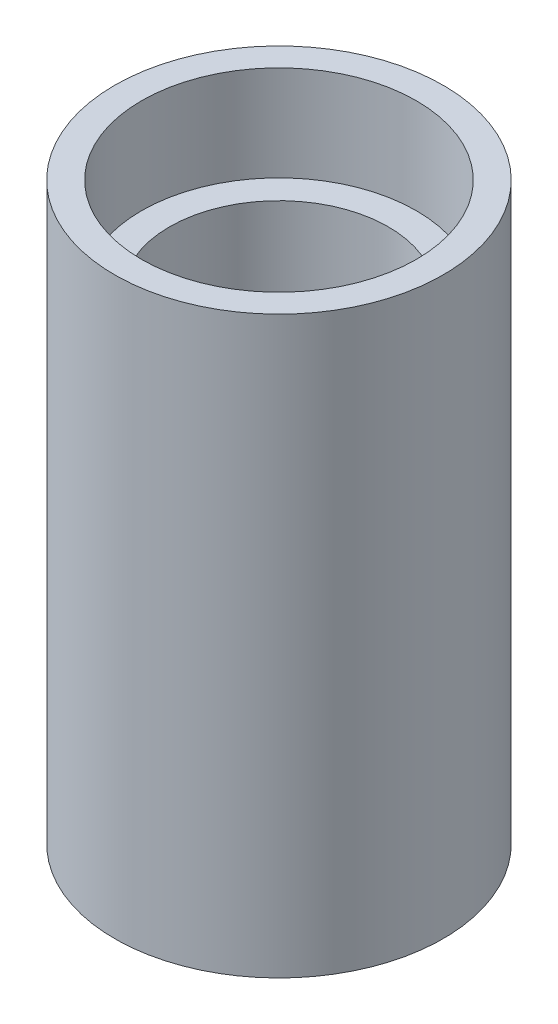
ISO-10303-21;
HEADER;
FILE_DESCRIPTION(('STEP AP214'),'2;1');
FILE_NAME('part.step','',(''),(''),'','','');
FILE_SCHEMA(('AUTOMOTIVE_DESIGN { 1 0 10303 214 1 1 1 1 }'));
ENDSEC;
DATA;
#1=APPLICATION_CONTEXT('core data for automotive mechanical design processes');
#2=APPLICATION_PROTOCOL_DEFINITION('international standard','automotive_design',2000,#1);
#3=PRODUCT_CONTEXT('',#1,'mechanical');
#4=PRODUCT('Part','Part','',(#3));
#5=PRODUCT_RELATED_PRODUCT_CATEGORY('part','',(#4));
#6=PRODUCT_DEFINITION_FORMATION('','',#4);
#7=PRODUCT_DEFINITION_CONTEXT('part definition',#1,'design');
#8=PRODUCT_DEFINITION('design','',#6,#7);
#9=PRODUCT_DEFINITION_SHAPE('','',#8);
#10=(LENGTH_UNIT() NAMED_UNIT(*) SI_UNIT(.MILLI.,.METRE.));
#11=(NAMED_UNIT(*) PLANE_ANGLE_UNIT() SI_UNIT($,.RADIAN.));
#12=(NAMED_UNIT(*) SI_UNIT($,.STERADIAN.) SOLID_ANGLE_UNIT());
#13=UNCERTAINTY_MEASURE_WITH_UNIT(LENGTH_MEASURE(1.E-05),#10,'distance_accuracy_value','');
#14=(GEOMETRIC_REPRESENTATION_CONTEXT(3) GLOBAL_UNCERTAINTY_ASSIGNED_CONTEXT((#13)) GLOBAL_UNIT_ASSIGNED_CONTEXT((#10,
#11,#12)) REPRESENTATION_CONTEXT('',''));
#15=CARTESIAN_POINT('',(0.,0.,0.));
#16=DIRECTION('',(0.,0.,1.));
#17=DIRECTION('',(1.,0.,0.));
#18=AXIS2_PLACEMENT_3D('',#15,#16,#17);
#19=CARTESIAN_POINT('',(0.,55.7467725164634,0.));
#20=DIRECTION('',(0.,1.,0.));
#21=DIRECTION('',(-1.,0.,0.));
#22=AXIS2_PLACEMENT_3D('',#19,#20,#21);
#23=CYLINDRICAL_SURFACE('',#22,25.4);
#24=CARTESIAN_POINT('',(0.,0.,0.));
#25=DIRECTION('',(0.,1.,0.));
#26=DIRECTION('',(-1.,0.,0.));
#27=AXIS2_PLACEMENT_3D('',#24,#25,#26);
#28=CIRCLE('',#27,25.4);
#29=CARTESIAN_POINT('',(-25.4,0.,0.));
#30=VERTEX_POINT('',#29);
#31=EDGE_CURVE('E57',#30,#30,#28,.T.);
#32=ORIENTED_EDGE('',*,*,#31,.F.);
#33=EDGE_LOOP('',(#32));
#34=FACE_BOUND('',#33,.T.);
#35=CARTESIAN_POINT('',(0.,111.252,0.));
#36=DIRECTION('',(0.,1.,0.));
#37=DIRECTION('',(-1.,0.,0.));
#38=AXIS2_PLACEMENT_3D('',#35,#36,#37);
#39=CIRCLE('',#38,25.4);
#40=CARTESIAN_POINT('',(-25.4,111.252,0.));
#41=VERTEX_POINT('',#40);
#42=EDGE_CURVE('E10',#41,#41,#39,.T.);
#43=ORIENTED_EDGE('',*,*,#42,.T.);
#44=EDGE_LOOP('',(#43));
#45=FACE_BOUND('',#44,.T.);
#46=ADVANCED_FACE('F35',(#34,#45),#23,.F.);
#47=CARTESIAN_POINT('',(25.4,111.252,0.));
#48=DIRECTION('',(0.,-1.,0.));
#49=DIRECTION('',(1.,0.,0.));
#50=AXIS2_PLACEMENT_3D('',#47,#48,#49);
#51=PLANE('',#50);
#52=ORIENTED_EDGE('',*,*,#42,.F.);
#53=EDGE_LOOP('',(#52));
#54=FACE_BOUND('',#53,.T.);
#55=CARTESIAN_POINT('',(0.,111.252,0.));
#56=DIRECTION('',(0.,1.,0.));
#57=DIRECTION('',(-1.,0.,0.));
#58=AXIS2_PLACEMENT_3D('',#55,#56,#57);
#59=CIRCLE('',#58,31.877);
#60=CARTESIAN_POINT('',(-31.877,111.252,0.));
#61=VERTEX_POINT('',#60);
#62=EDGE_CURVE('E41',#61,#61,#59,.T.);
#63=ORIENTED_EDGE('',*,*,#62,.T.);
#64=EDGE_LOOP('',(#63));
#65=FACE_BOUND('',#64,.T.);
#66=ADVANCED_FACE('F64',(#54,#65),#51,.F.);
#67=CARTESIAN_POINT('',(0.,55.7467725164634,0.));
#68=DIRECTION('',(0.,1.,0.));
#69=DIRECTION('',(-1.,0.,0.));
#70=AXIS2_PLACEMENT_3D('',#67,#68,#69);
#71=CYLINDRICAL_SURFACE('',#70,31.877);
#72=ORIENTED_EDGE('',*,*,#62,.F.);
#73=EDGE_LOOP('',(#72));
#74=FACE_BOUND('',#73,.T.);
#75=CARTESIAN_POINT('',(0.,133.35,0.));
#76=DIRECTION('',(0.,1.,0.));
#77=DIRECTION('',(-1.,0.,0.));
#78=AXIS2_PLACEMENT_3D('',#75,#76,#77);
#79=CIRCLE('',#78,31.877);
#80=CARTESIAN_POINT('',(-31.877,133.35,0.));
#81=VERTEX_POINT('',#80);
#82=EDGE_CURVE('E45',#81,#81,#79,.T.);
#83=ORIENTED_EDGE('',*,*,#82,.T.);
#84=EDGE_LOOP('',(#83));
#85=FACE_BOUND('',#84,.T.);
#86=ADVANCED_FACE('F68',(#74,#85),#71,.F.);
#87=CARTESIAN_POINT('',(31.877,133.35,0.));
#88=DIRECTION('',(0.,-1.,0.));
#89=DIRECTION('',(1.,0.,0.));
#90=AXIS2_PLACEMENT_3D('',#87,#88,#89);
#91=PLANE('',#90);
#92=ORIENTED_EDGE('',*,*,#82,.F.);
#93=EDGE_LOOP('',(#92));
#94=FACE_BOUND('',#93,.T.);
#95=CARTESIAN_POINT('',(0.,133.35,0.));
#96=DIRECTION('',(0.,1.,0.));
#97=DIRECTION('',(-1.,0.,0.));
#98=AXIS2_PLACEMENT_3D('',#95,#96,#97);
#99=CIRCLE('',#98,38.1);
#100=CARTESIAN_POINT('',(-38.1,133.35,0.));
#101=VERTEX_POINT('',#100);
#102=EDGE_CURVE('E49',#101,#101,#99,.T.);
#103=ORIENTED_EDGE('',*,*,#102,.T.);
#104=EDGE_LOOP('',(#103));
#105=FACE_BOUND('',#104,.T.);
#106=ADVANCED_FACE('F73',(#94,#105),#91,.F.);
#107=CARTESIAN_POINT('',(0.,55.7467725164634,0.));
#108=DIRECTION('',(0.,1.,0.));
#109=DIRECTION('',(-1.,0.,0.));
#110=AXIS2_PLACEMENT_3D('',#107,#108,#109);
#111=CYLINDRICAL_SURFACE('',#110,38.1);
#112=ORIENTED_EDGE('',*,*,#102,.F.);
#113=EDGE_LOOP('',(#112));
#114=FACE_BOUND('',#113,.T.);
#115=CARTESIAN_POINT('',(0.,0.,0.));
#116=DIRECTION('',(0.,1.,0.));
#117=DIRECTION('',(-1.,0.,0.));
#118=AXIS2_PLACEMENT_3D('',#115,#116,#117);
#119=CIRCLE('',#118,38.1);
#120=CARTESIAN_POINT('',(-38.1,0.,0.));
#121=VERTEX_POINT('',#120);
#122=EDGE_CURVE('E54',#121,#121,#119,.T.);
#123=ORIENTED_EDGE('',*,*,#122,.T.);
#124=EDGE_LOOP('',(#123));
#125=FACE_BOUND('',#124,.T.);
#126=ADVANCED_FACE('F79',(#114,#125),#111,.T.);
#127=CARTESIAN_POINT('',(25.4,0.,0.));
#128=DIRECTION('',(0.,1.,0.));
#129=DIRECTION('',(-1.,0.,0.));
#130=AXIS2_PLACEMENT_3D('',#127,#128,#129);
#131=PLANE('',#130);
#132=ORIENTED_EDGE('',*,*,#122,.F.);
#133=EDGE_LOOP('',(#132));
#134=FACE_BOUND('',#133,.T.);
#135=ORIENTED_EDGE('',*,*,#31,.T.);
#136=EDGE_LOOP('',(#135));
#137=FACE_BOUND('',#136,.T.);
#138=ADVANCED_FACE('F61',(#134,#137),#131,.F.);
#139=CLOSED_SHELL('',(#46,#66,#86,#106,#126,#138));
#140=MANIFOLD_SOLID_BREP('B2',#139);
#141=ADVANCED_BREP_SHAPE_REPRESENTATION('',(#18,#140),#14);
#142=SHAPE_DEFINITION_REPRESENTATION(#9,#141);
ENDSEC;
END-ISO-10303-21;
